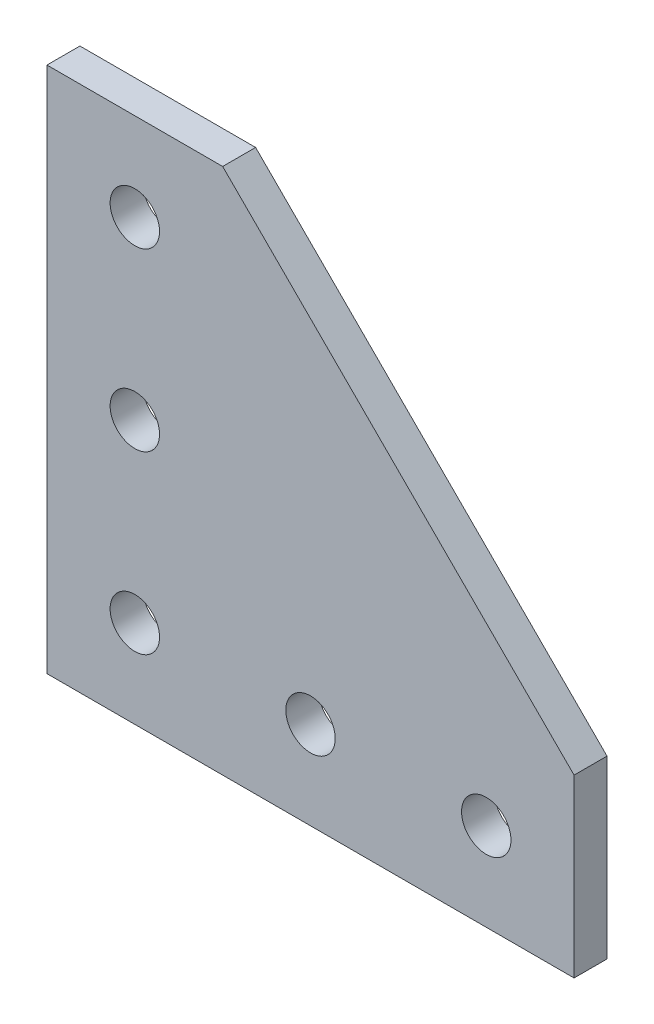
ISO-10303-21;
HEADER;
FILE_DESCRIPTION(('STEP AP214'),'2;1');
FILE_NAME('part.step','',(''),(''),'','','');
FILE_SCHEMA(('AUTOMOTIVE_DESIGN { 1 0 10303 214 1 1 1 1 }'));
ENDSEC;
DATA;
#1=APPLICATION_CONTEXT('core data for automotive mechanical design processes');
#2=APPLICATION_PROTOCOL_DEFINITION('international standard','automotive_design',2000,#1);
#3=PRODUCT_CONTEXT('',#1,'mechanical');
#4=PRODUCT('Part','Part','',(#3));
#5=PRODUCT_RELATED_PRODUCT_CATEGORY('part','',(#4));
#6=PRODUCT_DEFINITION_FORMATION('','',#4);
#7=PRODUCT_DEFINITION_CONTEXT('part definition',#1,'design');
#8=PRODUCT_DEFINITION('design','',#6,#7);
#9=PRODUCT_DEFINITION_SHAPE('','',#8);
#10=(LENGTH_UNIT() NAMED_UNIT(*) SI_UNIT(.MILLI.,.METRE.));
#11=(NAMED_UNIT(*) PLANE_ANGLE_UNIT() SI_UNIT($,.RADIAN.));
#12=(NAMED_UNIT(*) SI_UNIT($,.STERADIAN.) SOLID_ANGLE_UNIT());
#13=UNCERTAINTY_MEASURE_WITH_UNIT(LENGTH_MEASURE(1.E-05),#10,'distance_accuracy_value','');
#14=(GEOMETRIC_REPRESENTATION_CONTEXT(3) GLOBAL_UNCERTAINTY_ASSIGNED_CONTEXT((#13)) GLOBAL_UNIT_ASSIGNED_CONTEXT((#10,
#11,#12)) REPRESENTATION_CONTEXT('',''));
#15=CARTESIAN_POINT('',(0.,0.,0.));
#16=DIRECTION('',(0.,0.,1.));
#17=DIRECTION('',(1.,0.,0.));
#18=AXIS2_PLACEMENT_3D('',#15,#16,#17);
#19=CARTESIAN_POINT('',(0.,0.,-2.38125));
#20=DIRECTION('',(0.,0.,-1.));
#21=DIRECTION('',(-1.,0.,0.));
#22=AXIS2_PLACEMENT_3D('',#19,#20,#21);
#23=PLANE('',#22);
#24=CARTESIAN_POINT('',(12.7,63.5,-2.38125));
#25=DIRECTION('',(0.,0.,1.));
#26=DIRECTION('',(1.,0.,0.));
#27=AXIS2_PLACEMENT_3D('',#24,#25,#26);
#28=CIRCLE('',#27,3.57124);
#29=CARTESIAN_POINT('',(16.27124,63.5,-2.38125));
#30=VERTEX_POINT('',#29);
#31=EDGE_CURVE('E167',#30,#30,#28,.T.);
#32=ORIENTED_EDGE('',*,*,#31,.T.);
#33=EDGE_LOOP('',(#32));
#34=FACE_BOUND('',#33,.T.);
#35=CARTESIAN_POINT('',(12.7,38.1,-2.38125));
#36=DIRECTION('',(0.,0.,1.));
#37=DIRECTION('',(1.,0.,0.));
#38=AXIS2_PLACEMENT_3D('',#35,#36,#37);
#39=CIRCLE('',#38,3.57124);
#40=CARTESIAN_POINT('',(16.27124,38.1,-2.38125));
#41=VERTEX_POINT('',#40);
#42=EDGE_CURVE('E177',#41,#41,#39,.T.);
#43=ORIENTED_EDGE('',*,*,#42,.T.);
#44=EDGE_LOOP('',(#43));
#45=FACE_BOUND('',#44,.T.);
#46=CARTESIAN_POINT('',(38.1,12.7,-2.38125));
#47=DIRECTION('',(0.,0.,1.));
#48=DIRECTION('',(1.,0.,0.));
#49=AXIS2_PLACEMENT_3D('',#46,#47,#48);
#50=CIRCLE('',#49,3.57124);
#51=CARTESIAN_POINT('',(41.67124,12.7,-2.38125));
#52=VERTEX_POINT('',#51);
#53=EDGE_CURVE('E189',#52,#52,#50,.T.);
#54=ORIENTED_EDGE('',*,*,#53,.T.);
#55=EDGE_LOOP('',(#54));
#56=FACE_BOUND('',#55,.T.);
#57=CARTESIAN_POINT('',(63.5,12.7,-2.38125));
#58=DIRECTION('',(0.,0.,1.));
#59=DIRECTION('',(1.,0.,0.));
#60=AXIS2_PLACEMENT_3D('',#57,#58,#59);
#61=CIRCLE('',#60,3.57124);
#62=CARTESIAN_POINT('',(67.07124,12.7,-2.38125));
#63=VERTEX_POINT('',#62);
#64=EDGE_CURVE('E113',#63,#63,#61,.T.);
#65=ORIENTED_EDGE('',*,*,#64,.T.);
#66=EDGE_LOOP('',(#65));
#67=FACE_BOUND('',#66,.T.);
#68=DIRECTION('',(1.,0.,0.));
#69=VECTOR('',#68,1.);
#70=CARTESIAN_POINT('',(76.2,0.,-2.38125));
#71=LINE('',#70,#69);
#72=CARTESIAN_POINT('',(0.,0.,-2.38125));
#73=VERTEX_POINT('',#72);
#74=CARTESIAN_POINT('',(76.2,0.,-2.38125));
#75=VERTEX_POINT('',#74);
#76=EDGE_CURVE('E109',#73,#75,#71,.T.);
#77=ORIENTED_EDGE('',*,*,#76,.F.);
#78=DIRECTION('',(0.,-1.,0.));
#79=VECTOR('',#78,1.);
#80=CARTESIAN_POINT('',(0.,0.,-2.38125));
#81=LINE('',#80,#79);
#82=CARTESIAN_POINT('',(0.,76.2,-2.38125));
#83=VERTEX_POINT('',#82);
#84=EDGE_CURVE('E77',#83,#73,#81,.T.);
#85=ORIENTED_EDGE('',*,*,#84,.F.);
#86=DIRECTION('',(-1.,0.,0.));
#87=VECTOR('',#86,1.);
#88=CARTESIAN_POINT('',(0.,76.2,-2.38125));
#89=LINE('',#88,#87);
#90=CARTESIAN_POINT('',(25.4,76.2,-2.38125));
#91=VERTEX_POINT('',#90);
#92=EDGE_CURVE('E71',#91,#83,#89,.T.);
#93=ORIENTED_EDGE('',*,*,#92,.F.);
#94=DIRECTION('',(-0.707106781186547,0.707106781186547,0.));
#95=VECTOR('',#94,1.);
#96=CARTESIAN_POINT('',(76.2,25.4,-2.38125));
#97=LINE('',#96,#95);
#98=CARTESIAN_POINT('',(76.2,25.4,-2.38125));
#99=VERTEX_POINT('',#98);
#100=EDGE_CURVE('E100',#99,#91,#97,.T.);
#101=ORIENTED_EDGE('',*,*,#100,.F.);
#102=DIRECTION('',(0.,1.,0.));
#103=VECTOR('',#102,1.);
#104=CARTESIAN_POINT('',(76.2,25.4,-2.38125));
#105=LINE('',#104,#103);
#106=EDGE_CURVE('E112',#75,#99,#105,.T.);
#107=ORIENTED_EDGE('',*,*,#106,.F.);
#108=EDGE_LOOP('',(#77,#85,#93,#101,#107));
#109=FACE_BOUND('',#108,.T.);
#110=CARTESIAN_POINT('',(12.7,12.7,-2.38125));
#111=DIRECTION('',(0.,0.,1.));
#112=DIRECTION('',(1.,0.,0.));
#113=AXIS2_PLACEMENT_3D('',#110,#111,#112);
#114=CIRCLE('',#113,3.57124);
#115=CARTESIAN_POINT('',(16.27124,12.7,-2.38125));
#116=VERTEX_POINT('',#115);
#117=EDGE_CURVE('E183',#116,#116,#114,.T.);
#118=ORIENTED_EDGE('',*,*,#117,.T.);
#119=EDGE_LOOP('',(#118));
#120=FACE_BOUND('',#119,.T.);
#121=ADVANCED_FACE('F34',(#34,#45,#56,#67,#109,#120),#23,.T.);
#122=CARTESIAN_POINT('',(0.,0.,2.38125));
#123=DIRECTION('',(0.,0.,-1.));
#124=DIRECTION('',(-1.,0.,0.));
#125=AXIS2_PLACEMENT_3D('',#122,#123,#124);
#126=PLANE('',#125);
#127=CARTESIAN_POINT('',(12.7,63.5,2.38125));
#128=DIRECTION('',(0.,0.,1.));
#129=DIRECTION('',(1.,0.,0.));
#130=AXIS2_PLACEMENT_3D('',#127,#128,#129);
#131=CIRCLE('',#130,3.57123999999999);
#132=CARTESIAN_POINT('',(16.27124,63.5,2.38125));
#133=VERTEX_POINT('',#132);
#134=EDGE_CURVE('E170',#133,#133,#131,.T.);
#135=ORIENTED_EDGE('',*,*,#134,.F.);
#136=EDGE_LOOP('',(#135));
#137=FACE_BOUND('',#136,.T.);
#138=CARTESIAN_POINT('',(12.7,38.1,2.38125));
#139=DIRECTION('',(0.,0.,1.));
#140=DIRECTION('',(1.,0.,0.));
#141=AXIS2_PLACEMENT_3D('',#138,#139,#140);
#142=CIRCLE('',#141,3.57123999999999);
#143=CARTESIAN_POINT('',(16.27124,38.1,2.38125));
#144=VERTEX_POINT('',#143);
#145=EDGE_CURVE('E172',#144,#144,#142,.T.);
#146=ORIENTED_EDGE('',*,*,#145,.F.);
#147=EDGE_LOOP('',(#146));
#148=FACE_BOUND('',#147,.T.);
#149=CARTESIAN_POINT('',(12.7,12.7,2.38125));
#150=DIRECTION('',(0.,0.,1.));
#151=DIRECTION('',(1.,0.,0.));
#152=AXIS2_PLACEMENT_3D('',#149,#150,#151);
#153=CIRCLE('',#152,3.57123999999999);
#154=CARTESIAN_POINT('',(16.27124,12.7,2.38125));
#155=VERTEX_POINT('',#154);
#156=EDGE_CURVE('E180',#155,#155,#153,.T.);
#157=ORIENTED_EDGE('',*,*,#156,.F.);
#158=EDGE_LOOP('',(#157));
#159=FACE_BOUND('',#158,.T.);
#160=CARTESIAN_POINT('',(38.1,12.7,2.38125));
#161=DIRECTION('',(0.,0.,1.));
#162=DIRECTION('',(1.,0.,0.));
#163=AXIS2_PLACEMENT_3D('',#160,#161,#162);
#164=CIRCLE('',#163,3.57123999999999);
#165=CARTESIAN_POINT('',(41.67124,12.7,2.38125));
#166=VERTEX_POINT('',#165);
#167=EDGE_CURVE('E186',#166,#166,#164,.T.);
#168=ORIENTED_EDGE('',*,*,#167,.F.);
#169=EDGE_LOOP('',(#168));
#170=FACE_BOUND('',#169,.T.);
#171=CARTESIAN_POINT('',(63.5,12.7,2.38125));
#172=DIRECTION('',(0.,0.,1.));
#173=DIRECTION('',(1.,0.,0.));
#174=AXIS2_PLACEMENT_3D('',#171,#172,#173);
#175=CIRCLE('',#174,3.57123999999999);
#176=CARTESIAN_POINT('',(67.07124,12.7,2.38125));
#177=VERTEX_POINT('',#176);
#178=EDGE_CURVE('E192',#177,#177,#175,.T.);
#179=ORIENTED_EDGE('',*,*,#178,.F.);
#180=EDGE_LOOP('',(#179));
#181=FACE_BOUND('',#180,.T.);
#182=DIRECTION('',(1.,0.,0.));
#183=VECTOR('',#182,1.);
#184=CARTESIAN_POINT('',(76.2,0.,2.38125));
#185=LINE('',#184,#183);
#186=CARTESIAN_POINT('',(0.,0.,2.38125));
#187=VERTEX_POINT('',#186);
#188=CARTESIAN_POINT('',(76.2,0.,2.38125));
#189=VERTEX_POINT('',#188);
#190=EDGE_CURVE('E118',#187,#189,#185,.T.);
#191=ORIENTED_EDGE('',*,*,#190,.T.);
#192=DIRECTION('',(0.,1.,0.));
#193=VECTOR('',#192,1.);
#194=CARTESIAN_POINT('',(76.2,25.4,2.38125));
#195=LINE('',#194,#193);
#196=CARTESIAN_POINT('',(76.2,25.4,2.38125));
#197=VERTEX_POINT('',#196);
#198=EDGE_CURVE('E85',#189,#197,#195,.T.);
#199=ORIENTED_EDGE('',*,*,#198,.T.);
#200=DIRECTION('',(-0.707106781186547,0.707106781186547,0.));
#201=VECTOR('',#200,1.);
#202=CARTESIAN_POINT('',(76.2,25.4,2.38125));
#203=LINE('',#202,#201);
#204=CARTESIAN_POINT('',(25.4,76.2,2.38125));
#205=VERTEX_POINT('',#204);
#206=EDGE_CURVE('E89',#197,#205,#203,.T.);
#207=ORIENTED_EDGE('',*,*,#206,.T.);
#208=DIRECTION('',(-1.,0.,0.));
#209=VECTOR('',#208,1.);
#210=CARTESIAN_POINT('',(0.,76.2,2.38125));
#211=LINE('',#210,#209);
#212=CARTESIAN_POINT('',(0.,76.2,2.38125));
#213=VERTEX_POINT('',#212);
#214=EDGE_CURVE('E93',#205,#213,#211,.T.);
#215=ORIENTED_EDGE('',*,*,#214,.T.);
#216=DIRECTION('',(0.,-1.,0.));
#217=VECTOR('',#216,1.);
#218=CARTESIAN_POINT('',(0.,0.,2.38125));
#219=LINE('',#218,#217);
#220=EDGE_CURVE('E51',#213,#187,#219,.T.);
#221=ORIENTED_EDGE('',*,*,#220,.T.);
#222=EDGE_LOOP('',(#191,#199,#207,#215,#221));
#223=FACE_BOUND('',#222,.T.);
#224=ADVANCED_FACE('F91',(#137,#148,#159,#170,#181,#223),#126,.F.);
#225=CARTESIAN_POINT('',(76.2,0.,2.38125));
#226=DIRECTION('',(0.,1.,0.));
#227=DIRECTION('',(-1.,0.,0.));
#228=AXIS2_PLACEMENT_3D('',#225,#226,#227);
#229=PLANE('',#228);
#230=ORIENTED_EDGE('',*,*,#76,.T.);
#231=DIRECTION('',(0.,0.,-1.));
#232=VECTOR('',#231,1.);
#233=CARTESIAN_POINT('',(76.2,0.,2.38125));
#234=LINE('',#233,#232);
#235=EDGE_CURVE('E11',#189,#75,#234,.T.);
#236=ORIENTED_EDGE('',*,*,#235,.F.);
#237=ORIENTED_EDGE('',*,*,#190,.F.);
#238=DIRECTION('',(0.,0.,-1.));
#239=VECTOR('',#238,1.);
#240=CARTESIAN_POINT('',(0.,0.,2.38125));
#241=LINE('',#240,#239);
#242=EDGE_CURVE('E105',#187,#73,#241,.T.);
#243=ORIENTED_EDGE('',*,*,#242,.T.);
#244=EDGE_LOOP('',(#230,#236,#237,#243));
#245=FACE_BOUND('',#244,.T.);
#246=ADVANCED_FACE('F36',(#245),#229,.F.);
#247=CARTESIAN_POINT('',(76.2,25.4,2.38125));
#248=DIRECTION('',(-1.,0.,0.));
#249=DIRECTION('',(0.,0.,1.));
#250=AXIS2_PLACEMENT_3D('',#247,#248,#249);
#251=PLANE('',#250);
#252=ORIENTED_EDGE('',*,*,#106,.T.);
#253=DIRECTION('',(0.,0.,-1.));
#254=VECTOR('',#253,1.);
#255=CARTESIAN_POINT('',(76.2,25.4,2.38125));
#256=LINE('',#255,#254);
#257=EDGE_CURVE('E43',#197,#99,#256,.T.);
#258=ORIENTED_EDGE('',*,*,#257,.F.);
#259=ORIENTED_EDGE('',*,*,#198,.F.);
#260=ORIENTED_EDGE('',*,*,#235,.T.);
#261=EDGE_LOOP('',(#252,#258,#259,#260));
#262=FACE_BOUND('',#261,.T.);
#263=ADVANCED_FACE('F262',(#262),#251,.F.);
#264=CARTESIAN_POINT('',(76.2,25.4,2.38125));
#265=DIRECTION('',(-0.707106781186547,-0.707106781186547,0.));
#266=DIRECTION('',(0.707106781186548,-0.707106781186548,0.));
#267=AXIS2_PLACEMENT_3D('',#264,#265,#266);
#268=PLANE('',#267);
#269=ORIENTED_EDGE('',*,*,#100,.T.);
#270=DIRECTION('',(0.,0.,-1.));
#271=VECTOR('',#270,1.);
#272=CARTESIAN_POINT('',(25.4,76.2,2.38125));
#273=LINE('',#272,#271);
#274=EDGE_CURVE('E97',#205,#91,#273,.T.);
#275=ORIENTED_EDGE('',*,*,#274,.F.);
#276=ORIENTED_EDGE('',*,*,#206,.F.);
#277=ORIENTED_EDGE('',*,*,#257,.T.);
#278=EDGE_LOOP('',(#269,#275,#276,#277));
#279=FACE_BOUND('',#278,.T.);
#280=ADVANCED_FACE('F98',(#279),#268,.F.);
#281=CARTESIAN_POINT('',(0.,76.2,2.38125));
#282=DIRECTION('',(0.,-1.,0.));
#283=DIRECTION('',(0.,0.,-1.));
#284=AXIS2_PLACEMENT_3D('',#281,#282,#283);
#285=PLANE('',#284);
#286=ORIENTED_EDGE('',*,*,#92,.T.);
#287=DIRECTION('',(0.,0.,-1.));
#288=VECTOR('',#287,1.);
#289=CARTESIAN_POINT('',(0.,76.2,2.38125));
#290=LINE('',#289,#288);
#291=EDGE_CURVE('E101',#213,#83,#290,.T.);
#292=ORIENTED_EDGE('',*,*,#291,.F.);
#293=ORIENTED_EDGE('',*,*,#214,.F.);
#294=ORIENTED_EDGE('',*,*,#274,.T.);
#295=EDGE_LOOP('',(#286,#292,#293,#294));
#296=FACE_BOUND('',#295,.T.);
#297=ADVANCED_FACE('F103',(#296),#285,.F.);
#298=CARTESIAN_POINT('',(0.,0.,2.38125));
#299=DIRECTION('',(1.,0.,0.));
#300=DIRECTION('',(0.,0.,-1.));
#301=AXIS2_PLACEMENT_3D('',#298,#299,#300);
#302=PLANE('',#301);
#303=ORIENTED_EDGE('',*,*,#84,.T.);
#304=ORIENTED_EDGE('',*,*,#242,.F.);
#305=ORIENTED_EDGE('',*,*,#220,.F.);
#306=ORIENTED_EDGE('',*,*,#291,.T.);
#307=EDGE_LOOP('',(#303,#304,#305,#306));
#308=FACE_BOUND('',#307,.T.);
#309=ADVANCED_FACE('F126',(#308),#302,.F.);
#310=CARTESIAN_POINT('',(63.5,12.7,2.38125));
#311=DIRECTION('',(0.,0.,1.));
#312=DIRECTION('',(1.,0.,0.));
#313=AXIS2_PLACEMENT_3D('',#310,#311,#312);
#314=CYLINDRICAL_SURFACE('',#313,3.57124);
#315=ORIENTED_EDGE('',*,*,#64,.F.);
#316=EDGE_LOOP('',(#315));
#317=FACE_BOUND('',#316,.T.);
#318=ORIENTED_EDGE('',*,*,#178,.T.);
#319=EDGE_LOOP('',(#318));
#320=FACE_BOUND('',#319,.T.);
#321=ADVANCED_FACE('F128',(#317,#320),#314,.F.);
#322=CARTESIAN_POINT('',(38.1,12.7,2.38125));
#323=DIRECTION('',(0.,0.,1.));
#324=DIRECTION('',(1.,0.,0.));
#325=AXIS2_PLACEMENT_3D('',#322,#323,#324);
#326=CYLINDRICAL_SURFACE('',#325,3.57123999999999);
#327=ORIENTED_EDGE('',*,*,#53,.F.);
#328=EDGE_LOOP('',(#327));
#329=FACE_BOUND('',#328,.T.);
#330=ORIENTED_EDGE('',*,*,#167,.T.);
#331=EDGE_LOOP('',(#330));
#332=FACE_BOUND('',#331,.T.);
#333=ADVANCED_FACE('F134',(#329,#332),#326,.F.);
#334=CARTESIAN_POINT('',(12.7,12.7,2.38125));
#335=DIRECTION('',(0.,0.,1.));
#336=DIRECTION('',(1.,0.,0.));
#337=AXIS2_PLACEMENT_3D('',#334,#335,#336);
#338=CYLINDRICAL_SURFACE('',#337,3.57123999999999);
#339=ORIENTED_EDGE('',*,*,#117,.F.);
#340=EDGE_LOOP('',(#339));
#341=FACE_BOUND('',#340,.T.);
#342=ORIENTED_EDGE('',*,*,#156,.T.);
#343=EDGE_LOOP('',(#342));
#344=FACE_BOUND('',#343,.T.);
#345=ADVANCED_FACE('F151',(#341,#344),#338,.F.);
#346=CARTESIAN_POINT('',(12.7,38.1,2.38125));
#347=DIRECTION('',(0.,0.,1.));
#348=DIRECTION('',(1.,0.,0.));
#349=AXIS2_PLACEMENT_3D('',#346,#347,#348);
#350=CYLINDRICAL_SURFACE('',#349,3.57123999999999);
#351=ORIENTED_EDGE('',*,*,#42,.F.);
#352=EDGE_LOOP('',(#351));
#353=FACE_BOUND('',#352,.T.);
#354=ORIENTED_EDGE('',*,*,#145,.T.);
#355=EDGE_LOOP('',(#354));
#356=FACE_BOUND('',#355,.T.);
#357=ADVANCED_FACE('F155',(#353,#356),#350,.F.);
#358=CARTESIAN_POINT('',(12.7,63.5,2.38125));
#359=DIRECTION('',(0.,0.,1.));
#360=DIRECTION('',(1.,0.,0.));
#361=AXIS2_PLACEMENT_3D('',#358,#359,#360);
#362=CYLINDRICAL_SURFACE('',#361,3.57123999999999);
#363=ORIENTED_EDGE('',*,*,#31,.F.);
#364=EDGE_LOOP('',(#363));
#365=FACE_BOUND('',#364,.T.);
#366=ORIENTED_EDGE('',*,*,#134,.T.);
#367=EDGE_LOOP('',(#366));
#368=FACE_BOUND('',#367,.T.);
#369=ADVANCED_FACE('F159',(#365,#368),#362,.F.);
#370=CLOSED_SHELL('',(#121,#224,#246,#263,#280,#297,#309,#321,#333,#345,#357,#369));
#371=MANIFOLD_SOLID_BREP('B2',#370);
#372=ADVANCED_BREP_SHAPE_REPRESENTATION('',(#18,#371),#14);
#373=SHAPE_DEFINITION_REPRESENTATION(#9,#372);
ENDSEC;
END-ISO-10303-21;
